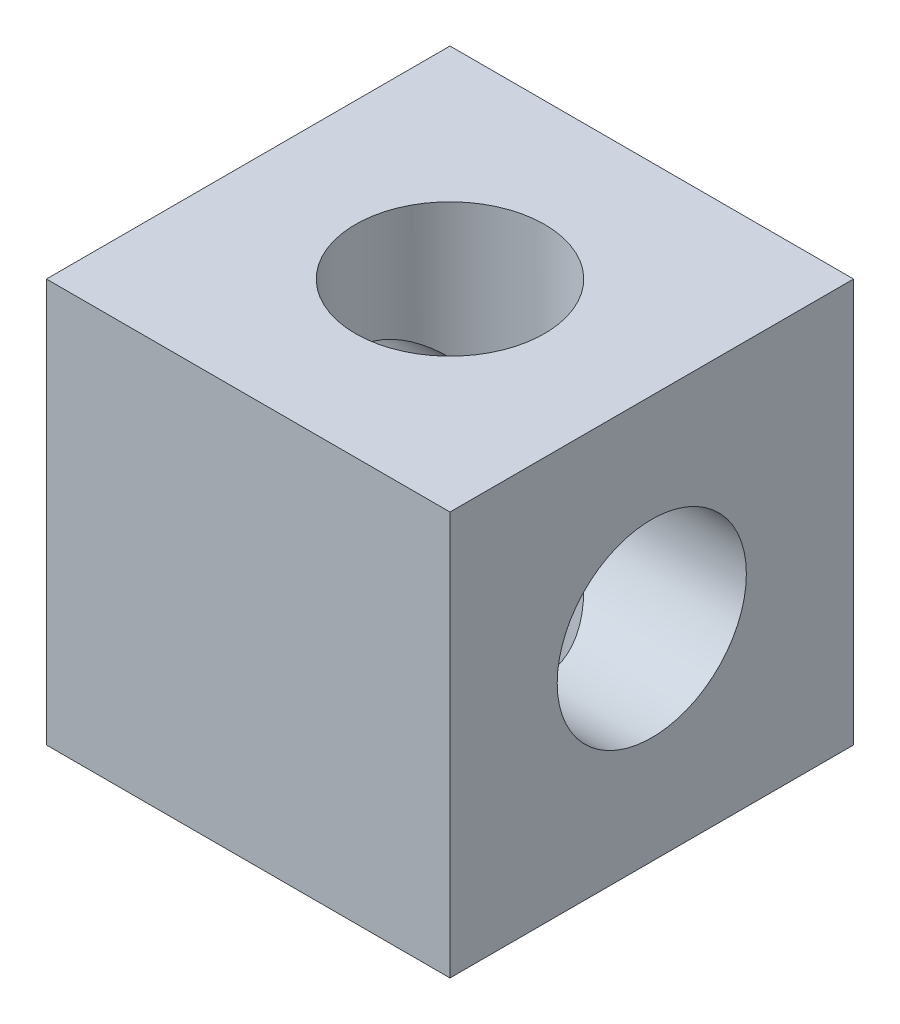
ISO-10303-21;
HEADER;
FILE_DESCRIPTION(('STEP AP214'),'2;1');
FILE_NAME('part.step','',(''),(''),'','','');
FILE_SCHEMA(('AUTOMOTIVE_DESIGN { 1 0 10303 214 1 1 1 1 }'));
ENDSEC;
DATA;
#1=APPLICATION_CONTEXT('core data for automotive mechanical design processes');
#2=APPLICATION_PROTOCOL_DEFINITION('international standard','automotive_design',2000,#1);
#3=PRODUCT_CONTEXT('',#1,'mechanical');
#4=PRODUCT('Part','Part','',(#3));
#5=PRODUCT_RELATED_PRODUCT_CATEGORY('part','',(#4));
#6=PRODUCT_DEFINITION_FORMATION('','',#4);
#7=PRODUCT_DEFINITION_CONTEXT('part definition',#1,'design');
#8=PRODUCT_DEFINITION('design','',#6,#7);
#9=PRODUCT_DEFINITION_SHAPE('','',#8);
#10=(LENGTH_UNIT() NAMED_UNIT(*) SI_UNIT(.MILLI.,.METRE.));
#11=(NAMED_UNIT(*) PLANE_ANGLE_UNIT() SI_UNIT($,.RADIAN.));
#12=(NAMED_UNIT(*) SI_UNIT($,.STERADIAN.) SOLID_ANGLE_UNIT());
#13=UNCERTAINTY_MEASURE_WITH_UNIT(LENGTH_MEASURE(1.E-05),#10,'distance_accuracy_value','');
#14=(GEOMETRIC_REPRESENTATION_CONTEXT(3) GLOBAL_UNCERTAINTY_ASSIGNED_CONTEXT((#13)) GLOBAL_UNIT_ASSIGNED_CONTEXT((#10,
#11,#12)) REPRESENTATION_CONTEXT('',''));
#15=CARTESIAN_POINT('',(0.,0.,0.));
#16=DIRECTION('',(0.,0.,1.));
#17=DIRECTION('',(1.,0.,0.));
#18=AXIS2_PLACEMENT_3D('',#15,#16,#17);
#19=CARTESIAN_POINT('',(-10.16,0.,0.));
#20=DIRECTION('',(-1.,0.,0.));
#21=DIRECTION('',(0.,0.,1.));
#22=AXIS2_PLACEMENT_3D('',#19,#20,#21);
#23=CYLINDRICAL_SURFACE('',#22,4.76249999999999);
#24=CARTESIAN_POINT('',(-10.16,0.,0.));
#25=DIRECTION('',(-1.,0.,0.));
#26=DIRECTION('',(0.,0.,1.));
#27=AXIS2_PLACEMENT_3D('',#24,#25,#26);
#28=CIRCLE('',#27,4.76249999999999);
#29=CARTESIAN_POINT('',(-10.16,0.,4.76249999999999));
#30=VERTEX_POINT('',#29);
#31=EDGE_CURVE('E132',#30,#30,#28,.T.);
#32=ORIENTED_EDGE('',*,*,#31,.T.);
#33=EDGE_LOOP('',(#32));
#34=FACE_BOUND('',#33,.T.);
#35=CARTESIAN_POINT('',(0.,0.,0.));
#36=DIRECTION('',(-0.707106781186547,-0.707106781186547,0.));
#37=DIRECTION('',(-0.707106781186547,0.707106781186547,0.));
#38=AXIS2_PLACEMENT_3D('',#35,#36,#37);
#39=ELLIPSE('',#38,6.73519209080185,4.76249999999999);
#40=CARTESIAN_POINT('',(0.,0.,-4.76249999999999));
#41=VERTEX_POINT('',#40);
#42=CARTESIAN_POINT('',(0.,0.,4.76249999999999));
#43=VERTEX_POINT('',#42);
#44=EDGE_CURVE('E48',#41,#43,#39,.F.);
#45=ORIENTED_EDGE('',*,*,#44,.T.);
#46=CARTESIAN_POINT('',(0.,0.,0.));
#47=DIRECTION('',(-0.707106781186547,0.707106781186547,0.));
#48=DIRECTION('',(-0.707106781186547,-0.707106781186547,0.));
#49=AXIS2_PLACEMENT_3D('',#46,#47,#48);
#50=ELLIPSE('',#49,6.73519209080185,4.76249999999999);
#51=EDGE_CURVE('E11',#43,#41,#50,.F.);
#52=ORIENTED_EDGE('',*,*,#51,.T.);
#53=EDGE_LOOP('',(#45,#52));
#54=FACE_BOUND('',#53,.T.);
#55=ADVANCED_FACE('F35',(#34,#54),#23,.F.);
#56=CARTESIAN_POINT('',(-10.16,10.16,10.16));
#57=DIRECTION('',(0.,0.,1.));
#58=DIRECTION('',(1.,0.,0.));
#59=AXIS2_PLACEMENT_3D('',#56,#57,#58);
#60=PLANE('',#59);
#61=DIRECTION('',(0.,-1.,0.));
#62=VECTOR('',#61,1.);
#63=CARTESIAN_POINT('',(10.16,10.16,10.16));
#64=LINE('',#63,#62);
#65=CARTESIAN_POINT('',(10.16,10.16,10.16));
#66=VERTEX_POINT('',#65);
#67=CARTESIAN_POINT('',(10.16,-10.16,10.16));
#68=VERTEX_POINT('',#67);
#69=EDGE_CURVE('E119',#66,#68,#64,.T.);
#70=ORIENTED_EDGE('',*,*,#69,.F.);
#71=DIRECTION('',(1.,0.,0.));
#72=VECTOR('',#71,1.);
#73=CARTESIAN_POINT('',(-10.16,10.16,10.16));
#74=LINE('',#73,#72);
#75=CARTESIAN_POINT('',(-10.16,10.16,10.16));
#76=VERTEX_POINT('',#75);
#77=EDGE_CURVE('E57',#76,#66,#74,.T.);
#78=ORIENTED_EDGE('',*,*,#77,.F.);
#79=DIRECTION('',(0.,-1.,0.));
#80=VECTOR('',#79,1.);
#81=CARTESIAN_POINT('',(-10.16,10.16,10.16));
#82=LINE('',#81,#80);
#83=CARTESIAN_POINT('',(-10.16,-10.16,10.16));
#84=VERTEX_POINT('',#83);
#85=EDGE_CURVE('E112',#76,#84,#82,.T.);
#86=ORIENTED_EDGE('',*,*,#85,.T.);
#87=DIRECTION('',(1.,0.,0.));
#88=VECTOR('',#87,1.);
#89=CARTESIAN_POINT('',(-10.16,-10.16,10.16));
#90=LINE('',#89,#88);
#91=EDGE_CURVE('E83',#84,#68,#90,.T.);
#92=ORIENTED_EDGE('',*,*,#91,.T.);
#93=EDGE_LOOP('',(#70,#78,#86,#92));
#94=FACE_BOUND('',#93,.T.);
#95=ADVANCED_FACE('F37',(#94),#60,.T.);
#96=CARTESIAN_POINT('',(-10.16,10.16,-10.16));
#97=DIRECTION('',(0.,1.,0.));
#98=DIRECTION('',(0.,0.,1.));
#99=AXIS2_PLACEMENT_3D('',#96,#97,#98);
#100=PLANE('',#99);
#101=CARTESIAN_POINT('',(0.,10.16,0.));
#102=DIRECTION('',(0.,1.,0.));
#103=DIRECTION('',(0.,0.,1.));
#104=AXIS2_PLACEMENT_3D('',#101,#102,#103);
#105=CIRCLE('',#104,4.76249999999999);
#106=CARTESIAN_POINT('',(0.,10.16,4.76249999999999));
#107=VERTEX_POINT('',#106);
#108=EDGE_CURVE('E138',#107,#107,#105,.T.);
#109=ORIENTED_EDGE('',*,*,#108,.F.);
#110=EDGE_LOOP('',(#109));
#111=FACE_BOUND('',#110,.T.);
#112=DIRECTION('',(0.,0.,1.));
#113=VECTOR('',#112,1.);
#114=CARTESIAN_POINT('',(10.16,10.16,-10.16));
#115=LINE('',#114,#113);
#116=CARTESIAN_POINT('',(10.16,10.16,-10.16));
#117=VERTEX_POINT('',#116);
#118=EDGE_CURVE('E109',#117,#66,#115,.T.);
#119=ORIENTED_EDGE('',*,*,#118,.F.);
#120=DIRECTION('',(1.,0.,0.));
#121=VECTOR('',#120,1.);
#122=CARTESIAN_POINT('',(-10.16,10.16,-10.16));
#123=LINE('',#122,#121);
#124=CARTESIAN_POINT('',(-10.16,10.16,-10.16));
#125=VERTEX_POINT('',#124);
#126=EDGE_CURVE('E106',#125,#117,#123,.T.);
#127=ORIENTED_EDGE('',*,*,#126,.F.);
#128=DIRECTION('',(0.,0.,1.));
#129=VECTOR('',#128,1.);
#130=CARTESIAN_POINT('',(-10.16,10.16,-10.16));
#131=LINE('',#130,#129);
#132=EDGE_CURVE('E104',#125,#76,#131,.T.);
#133=ORIENTED_EDGE('',*,*,#132,.T.);
#134=ORIENTED_EDGE('',*,*,#77,.T.);
#135=EDGE_LOOP('',(#119,#127,#133,#134));
#136=FACE_BOUND('',#135,.T.);
#137=ADVANCED_FACE('F143',(#111,#136),#100,.T.);
#138=CARTESIAN_POINT('',(-10.16,-10.16,-10.16));
#139=DIRECTION('',(0.,0.,-1.));
#140=DIRECTION('',(-1.,0.,0.));
#141=AXIS2_PLACEMENT_3D('',#138,#139,#140);
#142=PLANE('',#141);
#143=DIRECTION('',(0.,1.,0.));
#144=VECTOR('',#143,1.);
#145=CARTESIAN_POINT('',(10.16,-10.16,-10.16));
#146=LINE('',#145,#144);
#147=CARTESIAN_POINT('',(10.16,-10.16,-10.16));
#148=VERTEX_POINT('',#147);
#149=EDGE_CURVE('E113',#148,#117,#146,.T.);
#150=ORIENTED_EDGE('',*,*,#149,.F.);
#151=DIRECTION('',(1.,0.,0.));
#152=VECTOR('',#151,1.);
#153=CARTESIAN_POINT('',(-10.16,-10.16,-10.16));
#154=LINE('',#153,#152);
#155=CARTESIAN_POINT('',(-10.16,-10.16,-10.16));
#156=VERTEX_POINT('',#155);
#157=EDGE_CURVE('E103',#156,#148,#154,.T.);
#158=ORIENTED_EDGE('',*,*,#157,.F.);
#159=DIRECTION('',(0.,1.,0.));
#160=VECTOR('',#159,1.);
#161=CARTESIAN_POINT('',(-10.16,-10.16,-10.16));
#162=LINE('',#161,#160);
#163=EDGE_CURVE('E124',#156,#125,#162,.T.);
#164=ORIENTED_EDGE('',*,*,#163,.T.);
#165=ORIENTED_EDGE('',*,*,#126,.T.);
#166=EDGE_LOOP('',(#150,#158,#164,#165));
#167=FACE_BOUND('',#166,.T.);
#168=ADVANCED_FACE('F145',(#167),#142,.T.);
#169=CARTESIAN_POINT('',(-10.16,-10.16,10.16));
#170=DIRECTION('',(0.,-1.,0.));
#171=DIRECTION('',(0.,0.,-1.));
#172=AXIS2_PLACEMENT_3D('',#169,#170,#171);
#173=PLANE('',#172);
#174=CARTESIAN_POINT('',(0.,-10.16,0.));
#175=DIRECTION('',(0.,-1.,0.));
#176=DIRECTION('',(0.,0.,-1.));
#177=AXIS2_PLACEMENT_3D('',#174,#175,#176);
#178=CIRCLE('',#177,4.76249999999999);
#179=CARTESIAN_POINT('',(0.,-10.16,-4.76249999999999));
#180=VERTEX_POINT('',#179);
#181=EDGE_CURVE('E135',#180,#180,#178,.T.);
#182=ORIENTED_EDGE('',*,*,#181,.F.);
#183=EDGE_LOOP('',(#182));
#184=FACE_BOUND('',#183,.T.);
#185=DIRECTION('',(0.,0.,-1.));
#186=VECTOR('',#185,1.);
#187=CARTESIAN_POINT('',(10.16,-10.16,10.16));
#188=LINE('',#187,#186);
#189=EDGE_CURVE('E116',#68,#148,#188,.T.);
#190=ORIENTED_EDGE('',*,*,#189,.F.);
#191=ORIENTED_EDGE('',*,*,#91,.F.);
#192=DIRECTION('',(0.,0.,-1.));
#193=VECTOR('',#192,1.);
#194=CARTESIAN_POINT('',(-10.16,-10.16,10.16));
#195=LINE('',#194,#193);
#196=EDGE_CURVE('E127',#84,#156,#195,.T.);
#197=ORIENTED_EDGE('',*,*,#196,.T.);
#198=ORIENTED_EDGE('',*,*,#157,.T.);
#199=EDGE_LOOP('',(#190,#191,#197,#198));
#200=FACE_BOUND('',#199,.T.);
#201=ADVANCED_FACE('F155',(#184,#200),#173,.T.);
#202=CARTESIAN_POINT('',(-10.16,0.,0.));
#203=DIRECTION('',(1.,0.,0.));
#204=DIRECTION('',(0.,0.,-1.));
#205=AXIS2_PLACEMENT_3D('',#202,#203,#204);
#206=PLANE('',#205);
#207=ORIENTED_EDGE('',*,*,#31,.F.);
#208=EDGE_LOOP('',(#207));
#209=FACE_BOUND('',#208,.T.);
#210=ORIENTED_EDGE('',*,*,#85,.F.);
#211=ORIENTED_EDGE('',*,*,#132,.F.);
#212=ORIENTED_EDGE('',*,*,#163,.F.);
#213=ORIENTED_EDGE('',*,*,#196,.F.);
#214=EDGE_LOOP('',(#210,#211,#212,#213));
#215=FACE_BOUND('',#214,.T.);
#216=ADVANCED_FACE('F154',(#209,#215),#206,.F.);
#217=CARTESIAN_POINT('',(10.16,0.,0.));
#218=DIRECTION('',(1.,0.,0.));
#219=DIRECTION('',(0.,0.,-1.));
#220=AXIS2_PLACEMENT_3D('',#217,#218,#219);
#221=PLANE('',#220);
#222=CARTESIAN_POINT('',(10.16,0.,0.));
#223=DIRECTION('',(-1.,0.,0.));
#224=DIRECTION('',(0.,0.,1.));
#225=AXIS2_PLACEMENT_3D('',#222,#223,#224);
#226=CIRCLE('',#225,4.76249999999999);
#227=CARTESIAN_POINT('',(10.16,0.,4.76249999999999));
#228=VERTEX_POINT('',#227);
#229=EDGE_CURVE('E122',#228,#228,#226,.T.);
#230=ORIENTED_EDGE('',*,*,#229,.T.);
#231=EDGE_LOOP('',(#230));
#232=FACE_BOUND('',#231,.T.);
#233=ORIENTED_EDGE('',*,*,#69,.T.);
#234=ORIENTED_EDGE('',*,*,#189,.T.);
#235=ORIENTED_EDGE('',*,*,#149,.T.);
#236=ORIENTED_EDGE('',*,*,#118,.T.);
#237=EDGE_LOOP('',(#233,#234,#235,#236));
#238=FACE_BOUND('',#237,.T.);
#239=ADVANCED_FACE('F148',(#232,#238),#221,.T.);
#240=CARTESIAN_POINT('',(0.,0.,0.));
#241=DIRECTION('',(-0.707106781186547,-0.707106781186547,0.));
#242=DIRECTION('',(-0.707106781186547,0.707106781186547,0.));
#243=AXIS2_PLACEMENT_3D('',#240,#241,#242);
#244=ELLIPSE('',#243,6.73519209080185,4.76249999999999);
#245=EDGE_CURVE('E91',#41,#43,#244,.T.);
#246=ORIENTED_EDGE('',*,*,#245,.T.);
#247=CARTESIAN_POINT('',(0.,0.,0.));
#248=DIRECTION('',(-0.707106781186547,0.707106781186547,0.));
#249=DIRECTION('',(-0.707106781186547,-0.707106781186547,0.));
#250=AXIS2_PLACEMENT_3D('',#247,#248,#249);
#251=ELLIPSE('',#250,6.73519209080185,4.76249999999999);
#252=EDGE_CURVE('E43',#43,#41,#251,.T.);
#253=ORIENTED_EDGE('',*,*,#252,.T.);
#254=EDGE_LOOP('',(#246,#253));
#255=FACE_BOUND('',#254,.T.);
#256=ORIENTED_EDGE('',*,*,#229,.F.);
#257=EDGE_LOOP('',(#256));
#258=FACE_BOUND('',#257,.T.);
#259=ADVANCED_FACE('F99',(#255,#258),#23,.F.);
#260=CARTESIAN_POINT('',(0.,10.16,0.));
#261=DIRECTION('',(0.,1.,0.));
#262=DIRECTION('',(0.,0.,1.));
#263=AXIS2_PLACEMENT_3D('',#260,#261,#262);
#264=CYLINDRICAL_SURFACE('',#263,4.76249999999999);
#265=ORIENTED_EDGE('',*,*,#108,.T.);
#266=EDGE_LOOP('',(#265));
#267=FACE_BOUND('',#266,.T.);
#268=ORIENTED_EDGE('',*,*,#44,.F.);
#269=ORIENTED_EDGE('',*,*,#252,.F.);
#270=EDGE_LOOP('',(#268,#269));
#271=FACE_BOUND('',#270,.T.);
#272=ADVANCED_FACE('F97',(#267,#271),#264,.F.);
#273=ORIENTED_EDGE('',*,*,#181,.T.);
#274=EDGE_LOOP('',(#273));
#275=FACE_BOUND('',#274,.T.);
#276=ORIENTED_EDGE('',*,*,#245,.F.);
#277=ORIENTED_EDGE('',*,*,#51,.F.);
#278=EDGE_LOOP('',(#276,#277));
#279=FACE_BOUND('',#278,.T.);
#280=ADVANCED_FACE('F92',(#275,#279),#264,.F.);
#281=CLOSED_SHELL('',(#55,#95,#137,#168,#201,#216,#239,#259,#272,#280));
#282=MANIFOLD_SOLID_BREP('B2',#281);
#283=ADVANCED_BREP_SHAPE_REPRESENTATION('',(#18,#282),#14);
#284=SHAPE_DEFINITION_REPRESENTATION(#9,#283);
ENDSEC;
END-ISO-10303-21;
